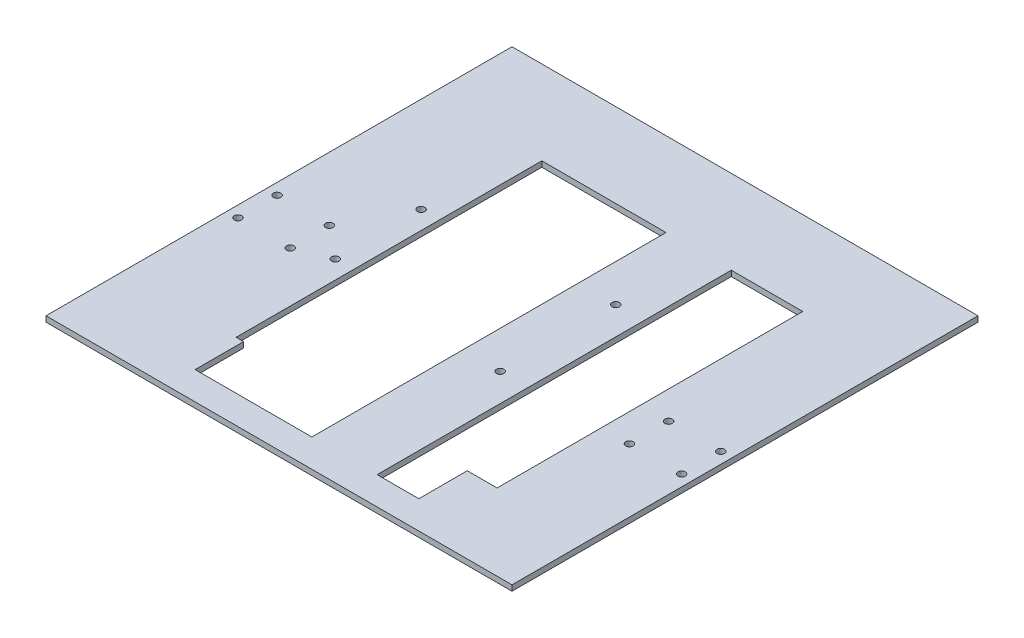
ISO-10303-21;
HEADER;
FILE_DESCRIPTION(('STEP AP214'),'2;1');
FILE_NAME('part.step','',(''),(''),'','','');
FILE_SCHEMA(('AUTOMOTIVE_DESIGN { 1 0 10303 214 1 1 1 1 }'));
ENDSEC;
DATA;
#1=APPLICATION_CONTEXT('core data for automotive mechanical design processes');
#2=APPLICATION_PROTOCOL_DEFINITION('international standard','automotive_design',2000,#1);
#3=PRODUCT_CONTEXT('',#1,'mechanical');
#4=PRODUCT('Part','Part','',(#3));
#5=PRODUCT_RELATED_PRODUCT_CATEGORY('part','',(#4));
#6=PRODUCT_DEFINITION_FORMATION('','',#4);
#7=PRODUCT_DEFINITION_CONTEXT('part definition',#1,'design');
#8=PRODUCT_DEFINITION('design','',#6,#7);
#9=PRODUCT_DEFINITION_SHAPE('','',#8);
#10=(LENGTH_UNIT() NAMED_UNIT(*) SI_UNIT(.MILLI.,.METRE.));
#11=(NAMED_UNIT(*) PLANE_ANGLE_UNIT() SI_UNIT($,.RADIAN.));
#12=(NAMED_UNIT(*) SI_UNIT($,.STERADIAN.) SOLID_ANGLE_UNIT());
#13=UNCERTAINTY_MEASURE_WITH_UNIT(LENGTH_MEASURE(1.E-05),#10,'distance_accuracy_value','');
#14=(GEOMETRIC_REPRESENTATION_CONTEXT(3) GLOBAL_UNCERTAINTY_ASSIGNED_CONTEXT((#13)) GLOBAL_UNIT_ASSIGNED_CONTEXT((#10,
#11,#12)) REPRESENTATION_CONTEXT('',''));
#15=CARTESIAN_POINT('',(0.,0.,0.));
#16=DIRECTION('',(0.,0.,1.));
#17=DIRECTION('',(1.,0.,0.));
#18=AXIS2_PLACEMENT_3D('',#15,#16,#17);
#19=CARTESIAN_POINT('',(-125.,3.,-125.));
#20=DIRECTION('',(1.,0.,0.));
#21=DIRECTION('',(0.,0.,-1.));
#22=AXIS2_PLACEMENT_3D('',#19,#20,#21);
#23=PLANE('',#22);
#24=DIRECTION('',(0.,0.,1.));
#25=VECTOR('',#24,1.);
#26=CARTESIAN_POINT('',(-125.,0.,-125.));
#27=LINE('',#26,#25);
#28=CARTESIAN_POINT('',(-125.,0.,-125.));
#29=VERTEX_POINT('',#28);
#30=CARTESIAN_POINT('',(-125.,0.,125.));
#31=VERTEX_POINT('',#30);
#32=EDGE_CURVE('E315',#29,#31,#27,.T.);
#33=ORIENTED_EDGE('',*,*,#32,.T.);
#34=DIRECTION('',(0.,-1.,0.));
#35=VECTOR('',#34,1.);
#36=CARTESIAN_POINT('',(-125.,3.,125.));
#37=LINE('',#36,#35);
#38=CARTESIAN_POINT('',(-125.,3.,125.));
#39=VERTEX_POINT('',#38);
#40=EDGE_CURVE('E11',#39,#31,#37,.T.);
#41=ORIENTED_EDGE('',*,*,#40,.F.);
#42=DIRECTION('',(0.,0.,1.));
#43=VECTOR('',#42,1.);
#44=CARTESIAN_POINT('',(-125.,3.,-125.));
#45=LINE('',#44,#43);
#46=CARTESIAN_POINT('',(-125.,3.,-125.));
#47=VERTEX_POINT('',#46);
#48=EDGE_CURVE('E318',#47,#39,#45,.T.);
#49=ORIENTED_EDGE('',*,*,#48,.F.);
#50=DIRECTION('',(0.,-1.,0.));
#51=VECTOR('',#50,1.);
#52=CARTESIAN_POINT('',(-125.,3.,-125.));
#53=LINE('',#52,#51);
#54=EDGE_CURVE('E328',#47,#29,#53,.T.);
#55=ORIENTED_EDGE('',*,*,#54,.T.);
#56=EDGE_LOOP('',(#33,#41,#49,#55));
#57=FACE_BOUND('',#56,.T.);
#58=ADVANCED_FACE('F33',(#57),#23,.F.);
#59=CARTESIAN_POINT('',(125.,3.,125.));
#60=DIRECTION('',(0.,0.,-1.));
#61=DIRECTION('',(-1.,0.,0.));
#62=AXIS2_PLACEMENT_3D('',#59,#60,#61);
#63=PLANE('',#62);
#64=DIRECTION('',(1.,0.,0.));
#65=VECTOR('',#64,1.);
#66=CARTESIAN_POINT('',(125.,0.,125.));
#67=LINE('',#66,#65);
#68=CARTESIAN_POINT('',(125.,0.,125.));
#69=VERTEX_POINT('',#68);
#70=EDGE_CURVE('E331',#31,#69,#67,.T.);
#71=ORIENTED_EDGE('',*,*,#70,.T.);
#72=DIRECTION('',(0.,-1.,0.));
#73=VECTOR('',#72,1.);
#74=CARTESIAN_POINT('',(125.,3.,125.));
#75=LINE('',#74,#73);
#76=CARTESIAN_POINT('',(125.,3.,125.));
#77=VERTEX_POINT('',#76);
#78=EDGE_CURVE('E40',#77,#69,#75,.T.);
#79=ORIENTED_EDGE('',*,*,#78,.F.);
#80=DIRECTION('',(1.,0.,0.));
#81=VECTOR('',#80,1.);
#82=CARTESIAN_POINT('',(125.,3.,125.));
#83=LINE('',#82,#81);
#84=EDGE_CURVE('E321',#39,#77,#83,.T.);
#85=ORIENTED_EDGE('',*,*,#84,.F.);
#86=ORIENTED_EDGE('',*,*,#40,.T.);
#87=EDGE_LOOP('',(#71,#79,#85,#86));
#88=FACE_BOUND('',#87,.T.);
#89=ADVANCED_FACE('F360',(#88),#63,.F.);
#90=CARTESIAN_POINT('',(125.,3.,-125.));
#91=DIRECTION('',(-1.,0.,0.));
#92=DIRECTION('',(0.,0.,1.));
#93=AXIS2_PLACEMENT_3D('',#90,#91,#92);
#94=PLANE('',#93);
#95=DIRECTION('',(0.,0.,-1.));
#96=VECTOR('',#95,1.);
#97=CARTESIAN_POINT('',(125.,0.,-125.));
#98=LINE('',#97,#96);
#99=CARTESIAN_POINT('',(125.,0.,-125.));
#100=VERTEX_POINT('',#99);
#101=EDGE_CURVE('E333',#69,#100,#98,.T.);
#102=ORIENTED_EDGE('',*,*,#101,.T.);
#103=DIRECTION('',(0.,-1.,0.));
#104=VECTOR('',#103,1.);
#105=CARTESIAN_POINT('',(125.,3.,-125.));
#106=LINE('',#105,#104);
#107=CARTESIAN_POINT('',(125.,3.,-125.));
#108=VERTEX_POINT('',#107);
#109=EDGE_CURVE('E338',#108,#100,#106,.T.);
#110=ORIENTED_EDGE('',*,*,#109,.F.);
#111=DIRECTION('',(0.,0.,-1.));
#112=VECTOR('',#111,1.);
#113=CARTESIAN_POINT('',(125.,3.,-125.));
#114=LINE('',#113,#112);
#115=EDGE_CURVE('E324',#77,#108,#114,.T.);
#116=ORIENTED_EDGE('',*,*,#115,.F.);
#117=ORIENTED_EDGE('',*,*,#78,.T.);
#118=EDGE_LOOP('',(#102,#110,#116,#117));
#119=FACE_BOUND('',#118,.T.);
#120=ADVANCED_FACE('F345',(#119),#94,.F.);
#121=CARTESIAN_POINT('',(125.,3.,-125.));
#122=DIRECTION('',(0.,0.,1.));
#123=DIRECTION('',(1.,0.,0.));
#124=AXIS2_PLACEMENT_3D('',#121,#122,#123);
#125=PLANE('',#124);
#126=DIRECTION('',(-1.,0.,0.));
#127=VECTOR('',#126,1.);
#128=CARTESIAN_POINT('',(125.,0.,-125.));
#129=LINE('',#128,#127);
#130=EDGE_CURVE('E322',#100,#29,#129,.T.);
#131=ORIENTED_EDGE('',*,*,#130,.T.);
#132=ORIENTED_EDGE('',*,*,#54,.F.);
#133=DIRECTION('',(-1.,0.,0.));
#134=VECTOR('',#133,1.);
#135=CARTESIAN_POINT('',(125.,3.,-125.));
#136=LINE('',#135,#134);
#137=EDGE_CURVE('E326',#108,#47,#136,.T.);
#138=ORIENTED_EDGE('',*,*,#137,.F.);
#139=ORIENTED_EDGE('',*,*,#109,.T.);
#140=EDGE_LOOP('',(#131,#132,#138,#139));
#141=FACE_BOUND('',#140,.T.);
#142=ADVANCED_FACE('F353',(#141),#125,.F.);
#143=CARTESIAN_POINT('',(0.,3.,0.));
#144=DIRECTION('',(0.,-1.,0.));
#145=DIRECTION('',(0.,0.,-1.));
#146=AXIS2_PLACEMENT_3D('',#143,#144,#145);
#147=PLANE('',#146);
#148=DIRECTION('',(1.,0.,0.));
#149=VECTOR('',#148,1.);
#150=CARTESIAN_POINT('',(60.0000000000001,3.,84.));
#151=LINE('',#150,#149);
#152=CARTESIAN_POINT('',(60.0000000000001,3.,84.));
#153=VERTEX_POINT('',#152);
#154=CARTESIAN_POINT('',(76.,3.,84.));
#155=VERTEX_POINT('',#154);
#156=EDGE_CURVE('E178',#153,#155,#151,.T.);
#157=ORIENTED_EDGE('',*,*,#156,.F.);
#158=DIRECTION('',(0.,0.,-1.));
#159=VECTOR('',#158,1.);
#160=CARTESIAN_POINT('',(60.0000000000001,3.,110.));
#161=LINE('',#160,#159);
#162=CARTESIAN_POINT('',(60.0000000000001,3.,110.));
#163=VERTEX_POINT('',#162);
#164=EDGE_CURVE('E47',#163,#153,#161,.T.);
#165=ORIENTED_EDGE('',*,*,#164,.F.);
#166=DIRECTION('',(1.,0.,0.));
#167=VECTOR('',#166,1.);
#168=CARTESIAN_POINT('',(37.628597089531,3.,110.));
#169=LINE('',#168,#167);
#170=CARTESIAN_POINT('',(37.628597089531,3.,110.));
#171=VERTEX_POINT('',#170);
#172=EDGE_CURVE('E164',#171,#163,#169,.T.);
#173=ORIENTED_EDGE('',*,*,#172,.F.);
#174=DIRECTION('',(0.,0.,1.));
#175=VECTOR('',#174,1.);
#176=CARTESIAN_POINT('',(37.628597089531,3.,-80.));
#177=LINE('',#176,#175);
#178=CARTESIAN_POINT('',(37.628597089531,3.,-80.));
#179=VERTEX_POINT('',#178);
#180=EDGE_CURVE('E167',#179,#171,#177,.T.);
#181=ORIENTED_EDGE('',*,*,#180,.F.);
#182=DIRECTION('',(-1.,0.,0.));
#183=VECTOR('',#182,1.);
#184=CARTESIAN_POINT('',(76.,3.,-80.));
#185=LINE('',#184,#183);
#186=CARTESIAN_POINT('',(76.,3.,-80.));
#187=VERTEX_POINT('',#186);
#188=EDGE_CURVE('E183',#187,#179,#185,.T.);
#189=ORIENTED_EDGE('',*,*,#188,.F.);
#190=DIRECTION('',(0.,0.,-1.));
#191=VECTOR('',#190,1.);
#192=CARTESIAN_POINT('',(76.,3.,84.));
#193=LINE('',#192,#191);
#194=EDGE_CURVE('E180',#155,#187,#193,.T.);
#195=ORIENTED_EDGE('',*,*,#194,.F.);
#196=EDGE_LOOP('',(#157,#165,#173,#181,#189,#195));
#197=FACE_BOUND('',#196,.T.);
#198=DIRECTION('',(1.,0.,0.));
#199=VECTOR('',#198,1.);
#200=CARTESIAN_POINT('',(2.62859708953101,3.,110.));
#201=LINE('',#200,#199);
#202=CARTESIAN_POINT('',(-60.,3.,110.));
#203=VERTEX_POINT('',#202);
#204=CARTESIAN_POINT('',(2.62859708953101,3.,110.));
#205=VERTEX_POINT('',#204);
#206=EDGE_CURVE('E219',#203,#205,#201,.T.);
#207=ORIENTED_EDGE('',*,*,#206,.F.);
#208=DIRECTION('',(0.,0.,1.));
#209=VECTOR('',#208,1.);
#210=CARTESIAN_POINT('',(-60.,3.,110.));
#211=LINE('',#210,#209);
#212=CARTESIAN_POINT('',(-60.,3.,84.));
#213=VERTEX_POINT('',#212);
#214=EDGE_CURVE('E190',#213,#203,#211,.T.);
#215=ORIENTED_EDGE('',*,*,#214,.F.);
#216=DIRECTION('',(1.,0.,0.));
#217=VECTOR('',#216,1.);
#218=CARTESIAN_POINT('',(-60.,3.,84.));
#219=LINE('',#218,#217);
#220=CARTESIAN_POINT('',(-64.,3.,84.));
#221=VERTEX_POINT('',#220);
#222=EDGE_CURVE('E202',#221,#213,#219,.T.);
#223=ORIENTED_EDGE('',*,*,#222,.F.);
#224=DIRECTION('',(0.,0.,1.));
#225=VECTOR('',#224,1.);
#226=CARTESIAN_POINT('',(-64.,3.,84.));
#227=LINE('',#226,#225);
#228=CARTESIAN_POINT('',(-64.,3.,-80.));
#229=VERTEX_POINT('',#228);
#230=EDGE_CURVE('E228',#229,#221,#227,.T.);
#231=ORIENTED_EDGE('',*,*,#230,.F.);
#232=DIRECTION('',(-1.,0.,0.));
#233=VECTOR('',#232,1.);
#234=CARTESIAN_POINT('',(2.62859708953101,3.,-80.));
#235=LINE('',#234,#233);
#236=CARTESIAN_POINT('',(2.62859708953101,3.,-80.));
#237=VERTEX_POINT('',#236);
#238=EDGE_CURVE('E225',#237,#229,#235,.T.);
#239=ORIENTED_EDGE('',*,*,#238,.F.);
#240=DIRECTION('',(0.,0.,-1.));
#241=VECTOR('',#240,1.);
#242=CARTESIAN_POINT('',(2.62859708953101,3.,110.));
#243=LINE('',#242,#241);
#244=EDGE_CURVE('E222',#205,#237,#243,.T.);
#245=ORIENTED_EDGE('',*,*,#244,.F.);
#246=EDGE_LOOP('',(#207,#215,#223,#231,#239,#245));
#247=FACE_BOUND('',#246,.T.);
#248=CARTESIAN_POINT('',(22.628597089531,3.,-33.));
#249=DIRECTION('',(0.,1.,0.));
#250=DIRECTION('',(0.,0.,1.));
#251=AXIS2_PLACEMENT_3D('',#248,#249,#250);
#252=CIRCLE('',#251,2.);
#253=CARTESIAN_POINT('',(22.628597089531,3.,-31.));
#254=VERTEX_POINT('',#253);
#255=EDGE_CURVE('E262',#254,#254,#252,.T.);
#256=ORIENTED_EDGE('',*,*,#255,.F.);
#257=EDGE_LOOP('',(#256));
#258=FACE_BOUND('',#257,.T.);
#259=CARTESIAN_POINT('',(22.628597089531,3.,29.));
#260=DIRECTION('',(0.,1.,0.));
#261=DIRECTION('',(0.,0.,1.));
#262=AXIS2_PLACEMENT_3D('',#259,#260,#261);
#263=CIRCLE('',#262,2.);
#264=CARTESIAN_POINT('',(22.628597089531,3.,31.));
#265=VERTEX_POINT('',#264);
#266=EDGE_CURVE('E256',#265,#265,#263,.T.);
#267=ORIENTED_EDGE('',*,*,#266,.F.);
#268=EDGE_LOOP('',(#267));
#269=FACE_BOUND('',#268,.T.);
#270=CARTESIAN_POINT('',(119.,3.,28.));
#271=DIRECTION('',(0.,1.,0.));
#272=DIRECTION('',(0.,0.,1.));
#273=AXIS2_PLACEMENT_3D('',#270,#271,#272);
#274=CIRCLE('',#273,2.);
#275=CARTESIAN_POINT('',(119.,3.,30.));
#276=VERTEX_POINT('',#275);
#277=EDGE_CURVE('E250',#276,#276,#274,.T.);
#278=ORIENTED_EDGE('',*,*,#277,.F.);
#279=EDGE_LOOP('',(#278));
#280=FACE_BOUND('',#279,.T.);
#281=CARTESIAN_POINT('',(119.,3.,7.));
#282=DIRECTION('',(0.,1.,0.));
#283=DIRECTION('',(0.,0.,1.));
#284=AXIS2_PLACEMENT_3D('',#281,#282,#283);
#285=CIRCLE('',#284,2.);
#286=CARTESIAN_POINT('',(119.,3.,9.));
#287=VERTEX_POINT('',#286);
#288=EDGE_CURVE('E249',#287,#287,#285,.T.);
#289=ORIENTED_EDGE('',*,*,#288,.F.);
#290=EDGE_LOOP('',(#289));
#291=FACE_BOUND('',#290,.T.);
#292=CARTESIAN_POINT('',(91.,3.,7.));
#293=DIRECTION('',(0.,1.,0.));
#294=DIRECTION('',(0.,0.,1.));
#295=AXIS2_PLACEMENT_3D('',#292,#293,#294);
#296=CIRCLE('',#295,2.);
#297=CARTESIAN_POINT('',(91.,3.,9.));
#298=VERTEX_POINT('',#297);
#299=EDGE_CURVE('E270',#298,#298,#296,.T.);
#300=ORIENTED_EDGE('',*,*,#299,.F.);
#301=EDGE_LOOP('',(#300));
#302=FACE_BOUND('',#301,.T.);
#303=CARTESIAN_POINT('',(-119.,3.,28.));
#304=DIRECTION('',(0.,1.,0.));
#305=DIRECTION('',(0.,0.,1.));
#306=AXIS2_PLACEMENT_3D('',#303,#304,#305);
#307=CIRCLE('',#306,2.);
#308=CARTESIAN_POINT('',(-119.,3.,30.));
#309=VERTEX_POINT('',#308);
#310=EDGE_CURVE('E235',#309,#309,#307,.T.);
#311=ORIENTED_EDGE('',*,*,#310,.F.);
#312=EDGE_LOOP('',(#311));
#313=FACE_BOUND('',#312,.T.);
#314=CARTESIAN_POINT('',(-119.,3.,7.00000000000002));
#315=DIRECTION('',(0.,1.,0.));
#316=DIRECTION('',(0.,0.,1.));
#317=AXIS2_PLACEMENT_3D('',#314,#315,#316);
#318=CIRCLE('',#317,2.);
#319=CARTESIAN_POINT('',(-119.,3.,9.00000000000002));
#320=VERTEX_POINT('',#319);
#321=EDGE_CURVE('E288',#320,#320,#318,.T.);
#322=ORIENTED_EDGE('',*,*,#321,.F.);
#323=EDGE_LOOP('',(#322));
#324=FACE_BOUND('',#323,.T.);
#325=CARTESIAN_POINT('',(-91.,3.,7.00000000000002));
#326=DIRECTION('',(0.,1.,0.));
#327=DIRECTION('',(0.,0.,1.));
#328=AXIS2_PLACEMENT_3D('',#325,#326,#327);
#329=CIRCLE('',#328,2.);
#330=CARTESIAN_POINT('',(-91.,3.,9.00000000000002));
#331=VERTEX_POINT('',#330);
#332=EDGE_CURVE('E282',#331,#331,#329,.T.);
#333=ORIENTED_EDGE('',*,*,#332,.F.);
#334=EDGE_LOOP('',(#333));
#335=FACE_BOUND('',#334,.T.);
#336=CARTESIAN_POINT('',(-91.,3.,28.));
#337=DIRECTION('',(0.,1.,0.));
#338=DIRECTION('',(0.,0.,1.));
#339=AXIS2_PLACEMENT_3D('',#336,#337,#338);
#340=CIRCLE('',#339,2.);
#341=CARTESIAN_POINT('',(-91.,3.,30.));
#342=VERTEX_POINT('',#341);
#343=EDGE_CURVE('E281',#342,#342,#340,.T.);
#344=ORIENTED_EDGE('',*,*,#343,.F.);
#345=EDGE_LOOP('',(#344));
#346=FACE_BOUND('',#345,.T.);
#347=CARTESIAN_POINT('',(-73.7763885336373,3.,21.0000000000002));
#348=DIRECTION('',(0.,1.,0.));
#349=DIRECTION('',(0.,0.,1.));
#350=AXIS2_PLACEMENT_3D('',#347,#348,#349);
#351=CIRCLE('',#350,2.);
#352=CARTESIAN_POINT('',(-73.7763885336373,3.,23.0000000000002));
#353=VERTEX_POINT('',#352);
#354=EDGE_CURVE('E304',#353,#353,#351,.T.);
#355=ORIENTED_EDGE('',*,*,#354,.F.);
#356=EDGE_LOOP('',(#355));
#357=FACE_BOUND('',#356,.T.);
#358=CARTESIAN_POINT('',(-73.7763885336373,3.,-24.9999999999998));
#359=DIRECTION('',(0.,1.,0.));
#360=DIRECTION('',(0.,0.,1.));
#361=AXIS2_PLACEMENT_3D('',#358,#359,#360);
#362=CIRCLE('',#361,2.);
#363=CARTESIAN_POINT('',(-73.7763885336373,3.,-22.9999999999998));
#364=VERTEX_POINT('',#363);
#365=EDGE_CURVE('E298',#364,#364,#362,.T.);
#366=ORIENTED_EDGE('',*,*,#365,.F.);
#367=EDGE_LOOP('',(#366));
#368=FACE_BOUND('',#367,.T.);
#369=CARTESIAN_POINT('',(91.,3.,28.));
#370=DIRECTION('',(0.,1.,0.));
#371=DIRECTION('',(0.,0.,1.));
#372=AXIS2_PLACEMENT_3D('',#369,#370,#371);
#373=CIRCLE('',#372,2.);
#374=CARTESIAN_POINT('',(91.,3.,30.));
#375=VERTEX_POINT('',#374);
#376=EDGE_CURVE('E269',#375,#375,#373,.T.);
#377=ORIENTED_EDGE('',*,*,#376,.F.);
#378=EDGE_LOOP('',(#377));
#379=FACE_BOUND('',#378,.T.);
#380=ORIENTED_EDGE('',*,*,#48,.T.);
#381=ORIENTED_EDGE('',*,*,#84,.T.);
#382=ORIENTED_EDGE('',*,*,#115,.T.);
#383=ORIENTED_EDGE('',*,*,#137,.T.);
#384=EDGE_LOOP('',(#380,#381,#382,#383));
#385=FACE_BOUND('',#384,.T.);
#386=ADVANCED_FACE('F359',(#197,#247,#258,#269,#280,#291,#302,#313,#324,#335,#346,#357,#368,
#379,#385),#147,.F.);
#387=CARTESIAN_POINT('',(0.,0.,0.));
#388=DIRECTION('',(0.,-1.,0.));
#389=DIRECTION('',(0.,0.,-1.));
#390=AXIS2_PLACEMENT_3D('',#387,#388,#389);
#391=PLANE('',#390);
#392=DIRECTION('',(0.,0.,-1.));
#393=VECTOR('',#392,1.);
#394=CARTESIAN_POINT('',(60.0000000000001,0.,110.));
#395=LINE('',#394,#393);
#396=CARTESIAN_POINT('',(60.0000000000001,0.,110.));
#397=VERTEX_POINT('',#396);
#398=CARTESIAN_POINT('',(60.0000000000001,0.,84.));
#399=VERTEX_POINT('',#398);
#400=EDGE_CURVE('E147',#397,#399,#395,.T.);
#401=ORIENTED_EDGE('',*,*,#400,.T.);
#402=DIRECTION('',(1.,0.,0.));
#403=VECTOR('',#402,1.);
#404=CARTESIAN_POINT('',(60.0000000000001,0.,84.));
#405=LINE('',#404,#403);
#406=CARTESIAN_POINT('',(76.,0.,84.));
#407=VERTEX_POINT('',#406);
#408=EDGE_CURVE('E156',#399,#407,#405,.T.);
#409=ORIENTED_EDGE('',*,*,#408,.T.);
#410=DIRECTION('',(0.,0.,-1.));
#411=VECTOR('',#410,1.);
#412=CARTESIAN_POINT('',(76.,0.,84.));
#413=LINE('',#412,#411);
#414=CARTESIAN_POINT('',(76.,0.,-80.));
#415=VERTEX_POINT('',#414);
#416=EDGE_CURVE('E55',#407,#415,#413,.T.);
#417=ORIENTED_EDGE('',*,*,#416,.T.);
#418=DIRECTION('',(-1.,0.,0.));
#419=VECTOR('',#418,1.);
#420=CARTESIAN_POINT('',(76.,0.,-80.));
#421=LINE('',#420,#419);
#422=CARTESIAN_POINT('',(37.628597089531,0.,-80.));
#423=VERTEX_POINT('',#422);
#424=EDGE_CURVE('E171',#415,#423,#421,.T.);
#425=ORIENTED_EDGE('',*,*,#424,.T.);
#426=DIRECTION('',(0.,0.,1.));
#427=VECTOR('',#426,1.);
#428=CARTESIAN_POINT('',(37.628597089531,0.,-80.));
#429=LINE('',#428,#427);
#430=CARTESIAN_POINT('',(37.628597089531,0.,110.));
#431=VERTEX_POINT('',#430);
#432=EDGE_CURVE('E174',#423,#431,#429,.T.);
#433=ORIENTED_EDGE('',*,*,#432,.T.);
#434=DIRECTION('',(1.,0.,0.));
#435=VECTOR('',#434,1.);
#436=CARTESIAN_POINT('',(37.628597089531,0.,110.));
#437=LINE('',#436,#435);
#438=EDGE_CURVE('E153',#431,#397,#437,.T.);
#439=ORIENTED_EDGE('',*,*,#438,.T.);
#440=EDGE_LOOP('',(#401,#409,#417,#425,#433,#439));
#441=FACE_BOUND('',#440,.T.);
#442=DIRECTION('',(0.,0.,1.));
#443=VECTOR('',#442,1.);
#444=CARTESIAN_POINT('',(-60.,0.,110.));
#445=LINE('',#444,#443);
#446=CARTESIAN_POINT('',(-60.,0.,84.));
#447=VERTEX_POINT('',#446);
#448=CARTESIAN_POINT('',(-60.,0.,110.));
#449=VERTEX_POINT('',#448);
#450=EDGE_CURVE('E198',#447,#449,#445,.T.);
#451=ORIENTED_EDGE('',*,*,#450,.T.);
#452=DIRECTION('',(1.,0.,0.));
#453=VECTOR('',#452,1.);
#454=CARTESIAN_POINT('',(2.62859708953101,0.,110.));
#455=LINE('',#454,#453);
#456=CARTESIAN_POINT('',(2.62859708953101,0.,110.));
#457=VERTEX_POINT('',#456);
#458=EDGE_CURVE('E201',#449,#457,#455,.T.);
#459=ORIENTED_EDGE('',*,*,#458,.T.);
#460=DIRECTION('',(0.,0.,-1.));
#461=VECTOR('',#460,1.);
#462=CARTESIAN_POINT('',(2.62859708953101,0.,110.));
#463=LINE('',#462,#461);
#464=CARTESIAN_POINT('',(2.62859708953101,0.,-80.));
#465=VERTEX_POINT('',#464);
#466=EDGE_CURVE('E205',#457,#465,#463,.T.);
#467=ORIENTED_EDGE('',*,*,#466,.T.);
#468=DIRECTION('',(-1.,0.,0.));
#469=VECTOR('',#468,1.);
#470=CARTESIAN_POINT('',(2.62859708953101,0.,-80.));
#471=LINE('',#470,#469);
#472=CARTESIAN_POINT('',(-64.,0.,-80.));
#473=VERTEX_POINT('',#472);
#474=EDGE_CURVE('E208',#465,#473,#471,.T.);
#475=ORIENTED_EDGE('',*,*,#474,.T.);
#476=DIRECTION('',(0.,0.,1.));
#477=VECTOR('',#476,1.);
#478=CARTESIAN_POINT('',(-64.,0.,84.));
#479=LINE('',#478,#477);
#480=CARTESIAN_POINT('',(-64.,0.,84.));
#481=VERTEX_POINT('',#480);
#482=EDGE_CURVE('E211',#473,#481,#479,.T.);
#483=ORIENTED_EDGE('',*,*,#482,.T.);
#484=DIRECTION('',(1.,0.,0.));
#485=VECTOR('',#484,1.);
#486=CARTESIAN_POINT('',(-60.,0.,84.));
#487=LINE('',#486,#485);
#488=EDGE_CURVE('E214',#481,#447,#487,.T.);
#489=ORIENTED_EDGE('',*,*,#488,.T.);
#490=EDGE_LOOP('',(#451,#459,#467,#475,#483,#489));
#491=FACE_BOUND('',#490,.T.);
#492=CARTESIAN_POINT('',(22.628597089531,0.,-33.));
#493=DIRECTION('',(0.,1.,0.));
#494=DIRECTION('',(0.,0.,1.));
#495=AXIS2_PLACEMENT_3D('',#492,#493,#494);
#496=CIRCLE('',#495,2.);
#497=CARTESIAN_POINT('',(22.628597089531,0.,-31.));
#498=VERTEX_POINT('',#497);
#499=EDGE_CURVE('E259',#498,#498,#496,.T.);
#500=ORIENTED_EDGE('',*,*,#499,.T.);
#501=EDGE_LOOP('',(#500));
#502=FACE_BOUND('',#501,.T.);
#503=CARTESIAN_POINT('',(22.628597089531,0.,29.));
#504=DIRECTION('',(0.,1.,0.));
#505=DIRECTION('',(0.,0.,1.));
#506=AXIS2_PLACEMENT_3D('',#503,#504,#505);
#507=CIRCLE('',#506,2.);
#508=CARTESIAN_POINT('',(22.628597089531,0.,31.));
#509=VERTEX_POINT('',#508);
#510=EDGE_CURVE('E253',#509,#509,#507,.T.);
#511=ORIENTED_EDGE('',*,*,#510,.T.);
#512=EDGE_LOOP('',(#511));
#513=FACE_BOUND('',#512,.T.);
#514=CARTESIAN_POINT('',(119.,0.,28.));
#515=DIRECTION('',(0.,1.,0.));
#516=DIRECTION('',(0.,0.,1.));
#517=AXIS2_PLACEMENT_3D('',#514,#515,#516);
#518=CIRCLE('',#517,2.);
#519=CARTESIAN_POINT('',(119.,0.,30.));
#520=VERTEX_POINT('',#519);
#521=EDGE_CURVE('E246',#520,#520,#518,.T.);
#522=ORIENTED_EDGE('',*,*,#521,.T.);
#523=EDGE_LOOP('',(#522));
#524=FACE_BOUND('',#523,.T.);
#525=CARTESIAN_POINT('',(119.,0.,7.));
#526=DIRECTION('',(0.,1.,0.));
#527=DIRECTION('',(0.,0.,1.));
#528=AXIS2_PLACEMENT_3D('',#525,#526,#527);
#529=CIRCLE('',#528,2.);
#530=CARTESIAN_POINT('',(119.,0.,9.));
#531=VERTEX_POINT('',#530);
#532=EDGE_CURVE('E273',#531,#531,#529,.T.);
#533=ORIENTED_EDGE('',*,*,#532,.T.);
#534=EDGE_LOOP('',(#533));
#535=FACE_BOUND('',#534,.T.);
#536=CARTESIAN_POINT('',(91.,0.,7.));
#537=DIRECTION('',(0.,1.,0.));
#538=DIRECTION('',(0.,0.,1.));
#539=AXIS2_PLACEMENT_3D('',#536,#537,#538);
#540=CIRCLE('',#539,2.);
#541=CARTESIAN_POINT('',(91.,0.,9.));
#542=VERTEX_POINT('',#541);
#543=EDGE_CURVE('E266',#542,#542,#540,.T.);
#544=ORIENTED_EDGE('',*,*,#543,.T.);
#545=EDGE_LOOP('',(#544));
#546=FACE_BOUND('',#545,.T.);
#547=CARTESIAN_POINT('',(-119.,0.,28.));
#548=DIRECTION('',(0.,1.,0.));
#549=DIRECTION('',(0.,0.,1.));
#550=AXIS2_PLACEMENT_3D('',#547,#548,#549);
#551=CIRCLE('',#550,2.);
#552=CARTESIAN_POINT('',(-119.,0.,30.));
#553=VERTEX_POINT('',#552);
#554=EDGE_CURVE('E291',#553,#553,#551,.T.);
#555=ORIENTED_EDGE('',*,*,#554,.T.);
#556=EDGE_LOOP('',(#555));
#557=FACE_BOUND('',#556,.T.);
#558=CARTESIAN_POINT('',(-119.,0.,7.00000000000002));
#559=DIRECTION('',(0.,1.,0.));
#560=DIRECTION('',(0.,0.,1.));
#561=AXIS2_PLACEMENT_3D('',#558,#559,#560);
#562=CIRCLE('',#561,2.);
#563=CARTESIAN_POINT('',(-119.,0.,9.00000000000002));
#564=VERTEX_POINT('',#563);
#565=EDGE_CURVE('E285',#564,#564,#562,.T.);
#566=ORIENTED_EDGE('',*,*,#565,.T.);
#567=EDGE_LOOP('',(#566));
#568=FACE_BOUND('',#567,.T.);
#569=CARTESIAN_POINT('',(-91.,0.,7.00000000000002));
#570=DIRECTION('',(0.,1.,0.));
#571=DIRECTION('',(0.,0.,1.));
#572=AXIS2_PLACEMENT_3D('',#569,#570,#571);
#573=CIRCLE('',#572,2.);
#574=CARTESIAN_POINT('',(-91.,0.,9.00000000000002));
#575=VERTEX_POINT('',#574);
#576=EDGE_CURVE('E278',#575,#575,#573,.T.);
#577=ORIENTED_EDGE('',*,*,#576,.T.);
#578=EDGE_LOOP('',(#577));
#579=FACE_BOUND('',#578,.T.);
#580=CARTESIAN_POINT('',(-91.,0.,28.));
#581=DIRECTION('',(0.,1.,0.));
#582=DIRECTION('',(0.,0.,1.));
#583=AXIS2_PLACEMENT_3D('',#580,#581,#582);
#584=CIRCLE('',#583,2.);
#585=CARTESIAN_POINT('',(-91.,0.,30.));
#586=VERTEX_POINT('',#585);
#587=EDGE_CURVE('E307',#586,#586,#584,.T.);
#588=ORIENTED_EDGE('',*,*,#587,.T.);
#589=EDGE_LOOP('',(#588));
#590=FACE_BOUND('',#589,.T.);
#591=CARTESIAN_POINT('',(-73.7763885336373,0.,21.0000000000002));
#592=DIRECTION('',(0.,1.,0.));
#593=DIRECTION('',(0.,0.,1.));
#594=AXIS2_PLACEMENT_3D('',#591,#592,#593);
#595=CIRCLE('',#594,2.);
#596=CARTESIAN_POINT('',(-73.7763885336373,0.,23.0000000000002));
#597=VERTEX_POINT('',#596);
#598=EDGE_CURVE('E301',#597,#597,#595,.T.);
#599=ORIENTED_EDGE('',*,*,#598,.T.);
#600=EDGE_LOOP('',(#599));
#601=FACE_BOUND('',#600,.T.);
#602=CARTESIAN_POINT('',(-73.7763885336373,0.,-24.9999999999998));
#603=DIRECTION('',(0.,1.,0.));
#604=DIRECTION('',(0.,0.,1.));
#605=AXIS2_PLACEMENT_3D('',#602,#603,#604);
#606=CIRCLE('',#605,2.);
#607=CARTESIAN_POINT('',(-73.7763885336373,0.,-22.9999999999998));
#608=VERTEX_POINT('',#607);
#609=EDGE_CURVE('E265',#608,#608,#606,.T.);
#610=ORIENTED_EDGE('',*,*,#609,.T.);
#611=EDGE_LOOP('',(#610));
#612=FACE_BOUND('',#611,.T.);
#613=CARTESIAN_POINT('',(91.,0.,28.));
#614=DIRECTION('',(0.,1.,0.));
#615=DIRECTION('',(0.,0.,1.));
#616=AXIS2_PLACEMENT_3D('',#613,#614,#615);
#617=CIRCLE('',#616,2.);
#618=CARTESIAN_POINT('',(91.,0.,30.));
#619=VERTEX_POINT('',#618);
#620=EDGE_CURVE('E312',#619,#619,#617,.T.);
#621=ORIENTED_EDGE('',*,*,#620,.T.);
#622=EDGE_LOOP('',(#621));
#623=FACE_BOUND('',#622,.T.);
#624=ORIENTED_EDGE('',*,*,#32,.F.);
#625=ORIENTED_EDGE('',*,*,#130,.F.);
#626=ORIENTED_EDGE('',*,*,#101,.F.);
#627=ORIENTED_EDGE('',*,*,#70,.F.);
#628=EDGE_LOOP('',(#624,#625,#626,#627));
#629=FACE_BOUND('',#628,.T.);
#630=ADVANCED_FACE('F160',(#441,#491,#502,#513,#524,#535,#546,#557,#568,#579,#590,#601,#612,
#623,#629),#391,.T.);
#631=CARTESIAN_POINT('',(91.,0.,28.));
#632=DIRECTION('',(0.,1.,0.));
#633=DIRECTION('',(0.,0.,1.));
#634=AXIS2_PLACEMENT_3D('',#631,#632,#633);
#635=CYLINDRICAL_SURFACE('',#634,2.);
#636=ORIENTED_EDGE('',*,*,#620,.F.);
#637=EDGE_LOOP('',(#636));
#638=FACE_BOUND('',#637,.T.);
#639=ORIENTED_EDGE('',*,*,#376,.T.);
#640=EDGE_LOOP('',(#639));
#641=FACE_BOUND('',#640,.T.);
#642=ADVANCED_FACE('F372',(#638,#641),#635,.F.);
#643=CARTESIAN_POINT('',(-73.7763885336373,0.,-24.9999999999998));
#644=DIRECTION('',(0.,1.,0.));
#645=DIRECTION('',(0.,0.,1.));
#646=AXIS2_PLACEMENT_3D('',#643,#644,#645);
#647=CYLINDRICAL_SURFACE('',#646,2.);
#648=ORIENTED_EDGE('',*,*,#609,.F.);
#649=EDGE_LOOP('',(#648));
#650=FACE_BOUND('',#649,.T.);
#651=ORIENTED_EDGE('',*,*,#365,.T.);
#652=EDGE_LOOP('',(#651));
#653=FACE_BOUND('',#652,.T.);
#654=ADVANCED_FACE('F378',(#650,#653),#647,.F.);
#655=CARTESIAN_POINT('',(-73.7763885336373,0.,21.0000000000002));
#656=DIRECTION('',(0.,1.,0.));
#657=DIRECTION('',(0.,0.,1.));
#658=AXIS2_PLACEMENT_3D('',#655,#656,#657);
#659=CYLINDRICAL_SURFACE('',#658,2.);
#660=ORIENTED_EDGE('',*,*,#598,.F.);
#661=EDGE_LOOP('',(#660));
#662=FACE_BOUND('',#661,.T.);
#663=ORIENTED_EDGE('',*,*,#354,.T.);
#664=EDGE_LOOP('',(#663));
#665=FACE_BOUND('',#664,.T.);
#666=ADVANCED_FACE('F384',(#662,#665),#659,.F.);
#667=CARTESIAN_POINT('',(-91.,0.,28.));
#668=DIRECTION('',(0.,1.,0.));
#669=DIRECTION('',(0.,0.,1.));
#670=AXIS2_PLACEMENT_3D('',#667,#668,#669);
#671=CYLINDRICAL_SURFACE('',#670,2.);
#672=ORIENTED_EDGE('',*,*,#587,.F.);
#673=EDGE_LOOP('',(#672));
#674=FACE_BOUND('',#673,.T.);
#675=ORIENTED_EDGE('',*,*,#343,.T.);
#676=EDGE_LOOP('',(#675));
#677=FACE_BOUND('',#676,.T.);
#678=ADVANCED_FACE('F380',(#674,#677),#671,.F.);
#679=CARTESIAN_POINT('',(-91.,0.,7.00000000000002));
#680=DIRECTION('',(0.,1.,0.));
#681=DIRECTION('',(0.,0.,1.));
#682=AXIS2_PLACEMENT_3D('',#679,#680,#681);
#683=CYLINDRICAL_SURFACE('',#682,2.);
#684=ORIENTED_EDGE('',*,*,#576,.F.);
#685=EDGE_LOOP('',(#684));
#686=FACE_BOUND('',#685,.T.);
#687=ORIENTED_EDGE('',*,*,#332,.T.);
#688=EDGE_LOOP('',(#687));
#689=FACE_BOUND('',#688,.T.);
#690=ADVANCED_FACE('F383',(#686,#689),#683,.F.);
#691=CARTESIAN_POINT('',(-119.,0.,7.00000000000002));
#692=DIRECTION('',(0.,1.,0.));
#693=DIRECTION('',(0.,0.,1.));
#694=AXIS2_PLACEMENT_3D('',#691,#692,#693);
#695=CYLINDRICAL_SURFACE('',#694,2.);
#696=ORIENTED_EDGE('',*,*,#565,.F.);
#697=EDGE_LOOP('',(#696));
#698=FACE_BOUND('',#697,.T.);
#699=ORIENTED_EDGE('',*,*,#321,.T.);
#700=EDGE_LOOP('',(#699));
#701=FACE_BOUND('',#700,.T.);
#702=ADVANCED_FACE('F396',(#698,#701),#695,.F.);
#703=CARTESIAN_POINT('',(-119.,0.,28.));
#704=DIRECTION('',(0.,1.,0.));
#705=DIRECTION('',(0.,0.,1.));
#706=AXIS2_PLACEMENT_3D('',#703,#704,#705);
#707=CYLINDRICAL_SURFACE('',#706,2.);
#708=ORIENTED_EDGE('',*,*,#554,.F.);
#709=EDGE_LOOP('',(#708));
#710=FACE_BOUND('',#709,.T.);
#711=ORIENTED_EDGE('',*,*,#310,.T.);
#712=EDGE_LOOP('',(#711));
#713=FACE_BOUND('',#712,.T.);
#714=ADVANCED_FACE('F392',(#710,#713),#707,.F.);
#715=CARTESIAN_POINT('',(91.,0.,7.));
#716=DIRECTION('',(0.,1.,0.));
#717=DIRECTION('',(0.,0.,1.));
#718=AXIS2_PLACEMENT_3D('',#715,#716,#717);
#719=CYLINDRICAL_SURFACE('',#718,2.);
#720=ORIENTED_EDGE('',*,*,#543,.F.);
#721=EDGE_LOOP('',(#720));
#722=FACE_BOUND('',#721,.T.);
#723=ORIENTED_EDGE('',*,*,#299,.T.);
#724=EDGE_LOOP('',(#723));
#725=FACE_BOUND('',#724,.T.);
#726=ADVANCED_FACE('F395',(#722,#725),#719,.F.);
#727=CARTESIAN_POINT('',(119.,0.,7.));
#728=DIRECTION('',(0.,1.,0.));
#729=DIRECTION('',(0.,0.,1.));
#730=AXIS2_PLACEMENT_3D('',#727,#728,#729);
#731=CYLINDRICAL_SURFACE('',#730,2.);
#732=ORIENTED_EDGE('',*,*,#532,.F.);
#733=EDGE_LOOP('',(#732));
#734=FACE_BOUND('',#733,.T.);
#735=ORIENTED_EDGE('',*,*,#288,.T.);
#736=EDGE_LOOP('',(#735));
#737=FACE_BOUND('',#736,.T.);
#738=ADVANCED_FACE('F404',(#734,#737),#731,.F.);
#739=CARTESIAN_POINT('',(119.,0.,28.));
#740=DIRECTION('',(0.,1.,0.));
#741=DIRECTION('',(0.,0.,1.));
#742=AXIS2_PLACEMENT_3D('',#739,#740,#741);
#743=CYLINDRICAL_SURFACE('',#742,2.);
#744=ORIENTED_EDGE('',*,*,#521,.F.);
#745=EDGE_LOOP('',(#744));
#746=FACE_BOUND('',#745,.T.);
#747=ORIENTED_EDGE('',*,*,#277,.T.);
#748=EDGE_LOOP('',(#747));
#749=FACE_BOUND('',#748,.T.);
#750=ADVANCED_FACE('F407',(#746,#749),#743,.F.);
#751=CARTESIAN_POINT('',(22.628597089531,0.,29.));
#752=DIRECTION('',(0.,1.,0.));
#753=DIRECTION('',(0.,0.,1.));
#754=AXIS2_PLACEMENT_3D('',#751,#752,#753);
#755=CYLINDRICAL_SURFACE('',#754,2.);
#756=ORIENTED_EDGE('',*,*,#510,.F.);
#757=EDGE_LOOP('',(#756));
#758=FACE_BOUND('',#757,.T.);
#759=ORIENTED_EDGE('',*,*,#266,.T.);
#760=EDGE_LOOP('',(#759));
#761=FACE_BOUND('',#760,.T.);
#762=ADVANCED_FACE('F416',(#758,#761),#755,.F.);
#763=CARTESIAN_POINT('',(22.628597089531,0.,-33.));
#764=DIRECTION('',(0.,1.,0.));
#765=DIRECTION('',(0.,0.,1.));
#766=AXIS2_PLACEMENT_3D('',#763,#764,#765);
#767=CYLINDRICAL_SURFACE('',#766,2.);
#768=ORIENTED_EDGE('',*,*,#499,.F.);
#769=EDGE_LOOP('',(#768));
#770=FACE_BOUND('',#769,.T.);
#771=ORIENTED_EDGE('',*,*,#255,.T.);
#772=EDGE_LOOP('',(#771));
#773=FACE_BOUND('',#772,.T.);
#774=ADVANCED_FACE('F412',(#770,#773),#767,.F.);
#775=CARTESIAN_POINT('',(-60.,0.,110.));
#776=DIRECTION('',(-1.,0.,0.));
#777=DIRECTION('',(0.,0.,1.));
#778=AXIS2_PLACEMENT_3D('',#775,#776,#777);
#779=PLANE('',#778);
#780=ORIENTED_EDGE('',*,*,#214,.T.);
#781=DIRECTION('',(0.,1.,0.));
#782=VECTOR('',#781,1.);
#783=CARTESIAN_POINT('',(-60.,0.,110.));
#784=LINE('',#783,#782);
#785=EDGE_CURVE('E217',#449,#203,#784,.T.);
#786=ORIENTED_EDGE('',*,*,#785,.F.);
#787=ORIENTED_EDGE('',*,*,#450,.F.);
#788=DIRECTION('',(0.,1.,0.));
#789=VECTOR('',#788,1.);
#790=CARTESIAN_POINT('',(-60.,0.,84.));
#791=LINE('',#790,#789);
#792=EDGE_CURVE('E233',#447,#213,#791,.T.);
#793=ORIENTED_EDGE('',*,*,#792,.T.);
#794=EDGE_LOOP('',(#780,#786,#787,#793));
#795=FACE_BOUND('',#794,.T.);
#796=ADVANCED_FACE('F415',(#795),#779,.F.);
#797=CARTESIAN_POINT('',(-60.,0.,84.));
#798=DIRECTION('',(0.,0.,1.));
#799=DIRECTION('',(1.,0.,0.));
#800=AXIS2_PLACEMENT_3D('',#797,#798,#799);
#801=PLANE('',#800);
#802=ORIENTED_EDGE('',*,*,#222,.T.);
#803=ORIENTED_EDGE('',*,*,#792,.F.);
#804=ORIENTED_EDGE('',*,*,#488,.F.);
#805=DIRECTION('',(0.,1.,0.));
#806=VECTOR('',#805,1.);
#807=CARTESIAN_POINT('',(-64.,0.,84.));
#808=LINE('',#807,#806);
#809=EDGE_CURVE('E236',#481,#221,#808,.T.);
#810=ORIENTED_EDGE('',*,*,#809,.T.);
#811=EDGE_LOOP('',(#802,#803,#804,#810));
#812=FACE_BOUND('',#811,.T.);
#813=ADVANCED_FACE('F426',(#812),#801,.F.);
#814=CARTESIAN_POINT('',(-64.,0.,84.));
#815=DIRECTION('',(-1.,0.,0.));
#816=DIRECTION('',(0.,0.,1.));
#817=AXIS2_PLACEMENT_3D('',#814,#815,#816);
#818=PLANE('',#817);
#819=ORIENTED_EDGE('',*,*,#230,.T.);
#820=ORIENTED_EDGE('',*,*,#809,.F.);
#821=ORIENTED_EDGE('',*,*,#482,.F.);
#822=DIRECTION('',(0.,1.,0.));
#823=VECTOR('',#822,1.);
#824=CARTESIAN_POINT('',(-64.,0.,-80.));
#825=LINE('',#824,#823);
#826=EDGE_CURVE('E238',#473,#229,#825,.T.);
#827=ORIENTED_EDGE('',*,*,#826,.T.);
#828=EDGE_LOOP('',(#819,#820,#821,#827));
#829=FACE_BOUND('',#828,.T.);
#830=ADVANCED_FACE('F439',(#829),#818,.F.);
#831=CARTESIAN_POINT('',(2.62859708953101,0.,-80.));
#832=DIRECTION('',(0.,0.,-1.));
#833=DIRECTION('',(-1.,0.,0.));
#834=AXIS2_PLACEMENT_3D('',#831,#832,#833);
#835=PLANE('',#834);
#836=ORIENTED_EDGE('',*,*,#238,.T.);
#837=ORIENTED_EDGE('',*,*,#826,.F.);
#838=ORIENTED_EDGE('',*,*,#474,.F.);
#839=DIRECTION('',(0.,1.,0.));
#840=VECTOR('',#839,1.);
#841=CARTESIAN_POINT('',(2.62859708953101,0.,-80.));
#842=LINE('',#841,#840);
#843=EDGE_CURVE('E240',#465,#237,#842,.T.);
#844=ORIENTED_EDGE('',*,*,#843,.T.);
#845=EDGE_LOOP('',(#836,#837,#838,#844));
#846=FACE_BOUND('',#845,.T.);
#847=ADVANCED_FACE('F435',(#846),#835,.F.);
#848=CARTESIAN_POINT('',(2.62859708953101,0.,110.));
#849=DIRECTION('',(1.,0.,0.));
#850=DIRECTION('',(0.,0.,-1.));
#851=AXIS2_PLACEMENT_3D('',#848,#849,#850);
#852=PLANE('',#851);
#853=ORIENTED_EDGE('',*,*,#244,.T.);
#854=ORIENTED_EDGE('',*,*,#843,.F.);
#855=ORIENTED_EDGE('',*,*,#466,.F.);
#856=DIRECTION('',(0.,1.,0.));
#857=VECTOR('',#856,1.);
#858=CARTESIAN_POINT('',(2.62859708953101,0.,110.));
#859=LINE('',#858,#857);
#860=EDGE_CURVE('E242',#457,#205,#859,.T.);
#861=ORIENTED_EDGE('',*,*,#860,.T.);
#862=EDGE_LOOP('',(#853,#854,#855,#861));
#863=FACE_BOUND('',#862,.T.);
#864=ADVANCED_FACE('F431',(#863),#852,.F.);
#865=CARTESIAN_POINT('',(2.62859708953101,0.,110.));
#866=DIRECTION('',(0.,0.,1.));
#867=DIRECTION('',(1.,0.,0.));
#868=AXIS2_PLACEMENT_3D('',#865,#866,#867);
#869=PLANE('',#868);
#870=ORIENTED_EDGE('',*,*,#206,.T.);
#871=ORIENTED_EDGE('',*,*,#860,.F.);
#872=ORIENTED_EDGE('',*,*,#458,.F.);
#873=ORIENTED_EDGE('',*,*,#785,.T.);
#874=EDGE_LOOP('',(#870,#871,#872,#873));
#875=FACE_BOUND('',#874,.T.);
#876=ADVANCED_FACE('F428',(#875),#869,.F.);
#877=CARTESIAN_POINT('',(60.0000000000001,0.,110.));
#878=DIRECTION('',(1.,0.,0.));
#879=DIRECTION('',(0.,0.,-1.));
#880=AXIS2_PLACEMENT_3D('',#877,#878,#879);
#881=PLANE('',#880);
#882=ORIENTED_EDGE('',*,*,#164,.T.);
#883=DIRECTION('',(0.,1.,0.));
#884=VECTOR('',#883,1.);
#885=CARTESIAN_POINT('',(60.0000000000001,0.,84.));
#886=LINE('',#885,#884);
#887=EDGE_CURVE('E143',#399,#153,#886,.T.);
#888=ORIENTED_EDGE('',*,*,#887,.F.);
#889=ORIENTED_EDGE('',*,*,#400,.F.);
#890=DIRECTION('',(0.,1.,0.));
#891=VECTOR('',#890,1.);
#892=CARTESIAN_POINT('',(60.0000000000001,0.,110.));
#893=LINE('',#892,#891);
#894=EDGE_CURVE('E188',#397,#163,#893,.T.);
#895=ORIENTED_EDGE('',*,*,#894,.T.);
#896=EDGE_LOOP('',(#882,#888,#889,#895));
#897=FACE_BOUND('',#896,.T.);
#898=ADVANCED_FACE('F145',(#897),#881,.F.);
#899=CARTESIAN_POINT('',(37.628597089531,0.,110.));
#900=DIRECTION('',(0.,0.,1.));
#901=DIRECTION('',(1.,0.,0.));
#902=AXIS2_PLACEMENT_3D('',#899,#900,#901);
#903=PLANE('',#902);
#904=ORIENTED_EDGE('',*,*,#172,.T.);
#905=ORIENTED_EDGE('',*,*,#894,.F.);
#906=ORIENTED_EDGE('',*,*,#438,.F.);
#907=DIRECTION('',(0.,1.,0.));
#908=VECTOR('',#907,1.);
#909=CARTESIAN_POINT('',(37.628597089531,0.,110.));
#910=LINE('',#909,#908);
#911=EDGE_CURVE('E191',#431,#171,#910,.T.);
#912=ORIENTED_EDGE('',*,*,#911,.T.);
#913=EDGE_LOOP('',(#904,#905,#906,#912));
#914=FACE_BOUND('',#913,.T.);
#915=ADVANCED_FACE('F449',(#914),#903,.F.);
#916=CARTESIAN_POINT('',(37.628597089531,0.,-80.));
#917=DIRECTION('',(-1.,0.,0.));
#918=DIRECTION('',(0.,0.,1.));
#919=AXIS2_PLACEMENT_3D('',#916,#917,#918);
#920=PLANE('',#919);
#921=ORIENTED_EDGE('',*,*,#180,.T.);
#922=ORIENTED_EDGE('',*,*,#911,.F.);
#923=ORIENTED_EDGE('',*,*,#432,.F.);
#924=DIRECTION('',(0.,1.,0.));
#925=VECTOR('',#924,1.);
#926=CARTESIAN_POINT('',(37.628597089531,0.,-80.));
#927=LINE('',#926,#925);
#928=EDGE_CURVE('E193',#423,#179,#927,.T.);
#929=ORIENTED_EDGE('',*,*,#928,.T.);
#930=EDGE_LOOP('',(#921,#922,#923,#929));
#931=FACE_BOUND('',#930,.T.);
#932=ADVANCED_FACE('F458',(#931),#920,.F.);
#933=CARTESIAN_POINT('',(76.,0.,-80.));
#934=DIRECTION('',(0.,0.,-1.));
#935=DIRECTION('',(-1.,0.,0.));
#936=AXIS2_PLACEMENT_3D('',#933,#934,#935);
#937=PLANE('',#936);
#938=ORIENTED_EDGE('',*,*,#188,.T.);
#939=ORIENTED_EDGE('',*,*,#928,.F.);
#940=ORIENTED_EDGE('',*,*,#424,.F.);
#941=DIRECTION('',(0.,1.,0.));
#942=VECTOR('',#941,1.);
#943=CARTESIAN_POINT('',(76.,0.,-80.));
#944=LINE('',#943,#942);
#945=EDGE_CURVE('E195',#415,#187,#944,.T.);
#946=ORIENTED_EDGE('',*,*,#945,.T.);
#947=EDGE_LOOP('',(#938,#939,#940,#946));
#948=FACE_BOUND('',#947,.T.);
#949=ADVANCED_FACE('F455',(#948),#937,.F.);
#950=CARTESIAN_POINT('',(76.,0.,84.));
#951=DIRECTION('',(1.,0.,0.));
#952=DIRECTION('',(0.,0.,-1.));
#953=AXIS2_PLACEMENT_3D('',#950,#951,#952);
#954=PLANE('',#953);
#955=ORIENTED_EDGE('',*,*,#194,.T.);
#956=ORIENTED_EDGE('',*,*,#945,.F.);
#957=ORIENTED_EDGE('',*,*,#416,.F.);
#958=DIRECTION('',(0.,1.,0.));
#959=VECTOR('',#958,1.);
#960=CARTESIAN_POINT('',(76.,0.,84.));
#961=LINE('',#960,#959);
#962=EDGE_CURVE('E152',#407,#155,#961,.T.);
#963=ORIENTED_EDGE('',*,*,#962,.T.);
#964=EDGE_LOOP('',(#955,#956,#957,#963));
#965=FACE_BOUND('',#964,.T.);
#966=ADVANCED_FACE('F452',(#965),#954,.F.);
#967=CARTESIAN_POINT('',(60.0000000000001,0.,84.));
#968=DIRECTION('',(0.,0.,1.));
#969=DIRECTION('',(1.,0.,0.));
#970=AXIS2_PLACEMENT_3D('',#967,#968,#969);
#971=PLANE('',#970);
#972=ORIENTED_EDGE('',*,*,#156,.T.);
#973=ORIENTED_EDGE('',*,*,#962,.F.);
#974=ORIENTED_EDGE('',*,*,#408,.F.);
#975=ORIENTED_EDGE('',*,*,#887,.T.);
#976=EDGE_LOOP('',(#972,#973,#974,#975));
#977=FACE_BOUND('',#976,.T.);
#978=ADVANCED_FACE('F157',(#977),#971,.F.);
#979=CLOSED_SHELL('',(#58,#89,#120,#142,#386,#630,#642,#654,#666,#678,#690,#702,#714,#726,#738,
#750,#762,#774,#796,#813,#830,#847,#864,#876,#898,#915,#932,#949,#966,#978));
#980=MANIFOLD_SOLID_BREP('B2',#979);
#981=ADVANCED_BREP_SHAPE_REPRESENTATION('',(#18,#980),#14);
#982=SHAPE_DEFINITION_REPRESENTATION(#9,#981);
ENDSEC;
END-ISO-10303-21;
